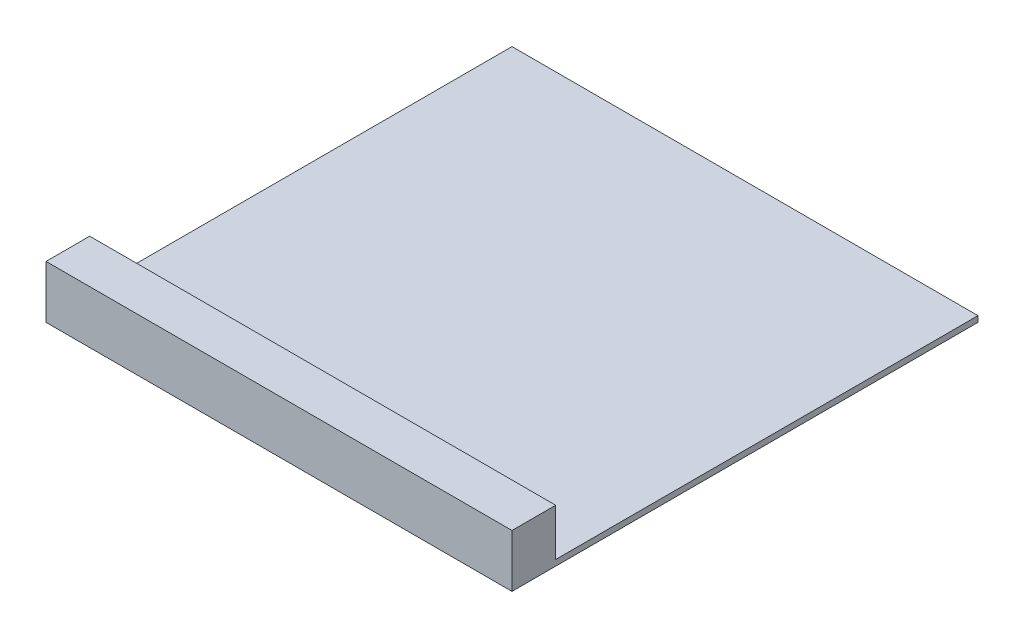
ISO-10303-21;
HEADER;
FILE_DESCRIPTION(('STEP AP214'),'2;1');
FILE_NAME('part.step','',(''),(''),'','','');
FILE_SCHEMA(('AUTOMOTIVE_DESIGN { 1 0 10303 214 1 1 1 1 }'));
ENDSEC;
DATA;
#1=APPLICATION_CONTEXT('core data for automotive mechanical design processes');
#2=APPLICATION_PROTOCOL_DEFINITION('international standard','automotive_design',2000,#1);
#3=PRODUCT_CONTEXT('',#1,'mechanical');
#4=PRODUCT('Part','Part','',(#3));
#5=PRODUCT_RELATED_PRODUCT_CATEGORY('part','',(#4));
#6=PRODUCT_DEFINITION_FORMATION('','',#4);
#7=PRODUCT_DEFINITION_CONTEXT('part definition',#1,'design');
#8=PRODUCT_DEFINITION('design','',#6,#7);
#9=PRODUCT_DEFINITION_SHAPE('','',#8);
#10=(LENGTH_UNIT() NAMED_UNIT(*) SI_UNIT(.MILLI.,.METRE.));
#11=(NAMED_UNIT(*) PLANE_ANGLE_UNIT() SI_UNIT($,.RADIAN.));
#12=(NAMED_UNIT(*) SI_UNIT($,.STERADIAN.) SOLID_ANGLE_UNIT());
#13=UNCERTAINTY_MEASURE_WITH_UNIT(LENGTH_MEASURE(1.E-05),#10,'distance_accuracy_value','');
#14=(GEOMETRIC_REPRESENTATION_CONTEXT(3) GLOBAL_UNCERTAINTY_ASSIGNED_CONTEXT((#13)) GLOBAL_UNIT_ASSIGNED_CONTEXT((#10,
#11,#12)) REPRESENTATION_CONTEXT('',''));
#15=CARTESIAN_POINT('',(0.,0.,0.));
#16=DIRECTION('',(0.,0.,1.));
#17=DIRECTION('',(1.,0.,0.));
#18=AXIS2_PLACEMENT_3D('',#15,#16,#17);
#19=CARTESIAN_POINT('',(-64.,14.5,-64.));
#20=DIRECTION('',(1.,0.,0.));
#21=DIRECTION('',(0.,0.,-1.));
#22=AXIS2_PLACEMENT_3D('',#19,#20,#21);
#23=PLANE('',#22);
#24=DIRECTION('',(0.,1.,0.));
#25=VECTOR('',#24,1.);
#26=CARTESIAN_POINT('',(-64.,-172.742583053513,52.));
#27=LINE('',#26,#25);
#28=CARTESIAN_POINT('',(-64.,1.59999999999999,52.));
#29=VERTEX_POINT('',#28);
#30=CARTESIAN_POINT('',(-64.,14.5,52.));
#31=VERTEX_POINT('',#30);
#32=EDGE_CURVE('E66',#29,#31,#27,.T.);
#33=ORIENTED_EDGE('',*,*,#32,.F.);
#34=DIRECTION('',(0.,0.,1.));
#35=VECTOR('',#34,1.);
#36=CARTESIAN_POINT('',(-64.,1.59999999999999,-64.));
#37=LINE('',#36,#35);
#38=CARTESIAN_POINT('',(-64.,1.59999999999999,-64.));
#39=VERTEX_POINT('',#38);
#40=EDGE_CURVE('E102',#39,#29,#37,.T.);
#41=ORIENTED_EDGE('',*,*,#40,.F.);
#42=DIRECTION('',(0.,-1.,0.));
#43=VECTOR('',#42,1.);
#44=CARTESIAN_POINT('',(-64.,14.5,-64.));
#45=LINE('',#44,#43);
#46=CARTESIAN_POINT('',(-64.,0.,-64.));
#47=VERTEX_POINT('',#46);
#48=EDGE_CURVE('E95',#39,#47,#45,.T.);
#49=ORIENTED_EDGE('',*,*,#48,.T.);
#50=DIRECTION('',(0.,0.,1.));
#51=VECTOR('',#50,1.);
#52=CARTESIAN_POINT('',(-64.,0.,-64.));
#53=LINE('',#52,#51);
#54=CARTESIAN_POINT('',(-64.,0.,64.));
#55=VERTEX_POINT('',#54);
#56=EDGE_CURVE('E99',#47,#55,#53,.T.);
#57=ORIENTED_EDGE('',*,*,#56,.T.);
#58=DIRECTION('',(0.,-1.,0.));
#59=VECTOR('',#58,1.);
#60=CARTESIAN_POINT('',(-64.,14.5,64.));
#61=LINE('',#60,#59);
#62=CARTESIAN_POINT('',(-64.,14.5,64.));
#63=VERTEX_POINT('',#62);
#64=EDGE_CURVE('E12',#63,#55,#61,.T.);
#65=ORIENTED_EDGE('',*,*,#64,.F.);
#66=DIRECTION('',(0.,0.,1.));
#67=VECTOR('',#66,1.);
#68=CARTESIAN_POINT('',(-64.,14.5,-64.));
#69=LINE('',#68,#67);
#70=EDGE_CURVE('E117',#31,#63,#69,.T.);
#71=ORIENTED_EDGE('',*,*,#70,.F.);
#72=EDGE_LOOP('',(#33,#41,#49,#57,#65,#71));
#73=FACE_BOUND('',#72,.T.);
#74=ADVANCED_FACE('F51',(#73),#23,.F.);
#75=CARTESIAN_POINT('',(64.,14.5,64.));
#76=DIRECTION('',(0.,0.,-1.));
#77=DIRECTION('',(-1.,0.,0.));
#78=AXIS2_PLACEMENT_3D('',#75,#76,#77);
#79=PLANE('',#78);
#80=DIRECTION('',(1.,0.,0.));
#81=VECTOR('',#80,1.);
#82=CARTESIAN_POINT('',(64.,0.,64.));
#83=LINE('',#82,#81);
#84=CARTESIAN_POINT('',(64.,0.,64.));
#85=VERTEX_POINT('',#84);
#86=EDGE_CURVE('E121',#55,#85,#83,.T.);
#87=ORIENTED_EDGE('',*,*,#86,.T.);
#88=DIRECTION('',(0.,-1.,0.));
#89=VECTOR('',#88,1.);
#90=CARTESIAN_POINT('',(64.,14.5,64.));
#91=LINE('',#90,#89);
#92=CARTESIAN_POINT('',(64.,14.5,64.));
#93=VERTEX_POINT('',#92);
#94=EDGE_CURVE('E59',#93,#85,#91,.T.);
#95=ORIENTED_EDGE('',*,*,#94,.F.);
#96=DIRECTION('',(1.,0.,0.));
#97=VECTOR('',#96,1.);
#98=CARTESIAN_POINT('',(64.,14.5,64.));
#99=LINE('',#98,#97);
#100=EDGE_CURVE('E75',#63,#93,#99,.T.);
#101=ORIENTED_EDGE('',*,*,#100,.F.);
#102=ORIENTED_EDGE('',*,*,#64,.T.);
#103=EDGE_LOOP('',(#87,#95,#101,#102));
#104=FACE_BOUND('',#103,.T.);
#105=ADVANCED_FACE('F145',(#104),#79,.F.);
#106=CARTESIAN_POINT('',(64.,14.5,-64.));
#107=DIRECTION('',(-1.,0.,0.));
#108=DIRECTION('',(0.,0.,1.));
#109=AXIS2_PLACEMENT_3D('',#106,#107,#108);
#110=PLANE('',#109);
#111=DIRECTION('',(0.,-1.,0.));
#112=VECTOR('',#111,1.);
#113=CARTESIAN_POINT('',(64.,14.5,-64.));
#114=LINE('',#113,#112);
#115=CARTESIAN_POINT('',(64.,1.59999999999999,-64.));
#116=VERTEX_POINT('',#115);
#117=CARTESIAN_POINT('',(64.,0.,-64.));
#118=VERTEX_POINT('',#117);
#119=EDGE_CURVE('E106',#116,#118,#114,.T.);
#120=ORIENTED_EDGE('',*,*,#119,.F.);
#121=DIRECTION('',(0.,0.,-1.));
#122=VECTOR('',#121,1.);
#123=CARTESIAN_POINT('',(64.,1.59999999999999,-64.));
#124=LINE('',#123,#122);
#125=CARTESIAN_POINT('',(64.,1.59999999999999,52.));
#126=VERTEX_POINT('',#125);
#127=EDGE_CURVE('E156',#126,#116,#124,.T.);
#128=ORIENTED_EDGE('',*,*,#127,.F.);
#129=DIRECTION('',(0.,1.,0.));
#130=VECTOR('',#129,1.);
#131=CARTESIAN_POINT('',(64.,-172.742583053513,52.));
#132=LINE('',#131,#130);
#133=CARTESIAN_POINT('',(64.,14.5,52.));
#134=VERTEX_POINT('',#133);
#135=EDGE_CURVE('E153',#126,#134,#132,.T.);
#136=ORIENTED_EDGE('',*,*,#135,.T.);
#137=DIRECTION('',(0.,0.,-1.));
#138=VECTOR('',#137,1.);
#139=CARTESIAN_POINT('',(64.,14.5,-64.));
#140=LINE('',#139,#138);
#141=EDGE_CURVE('E107',#93,#134,#140,.T.);
#142=ORIENTED_EDGE('',*,*,#141,.F.);
#143=ORIENTED_EDGE('',*,*,#94,.T.);
#144=DIRECTION('',(0.,0.,-1.));
#145=VECTOR('',#144,1.);
#146=CARTESIAN_POINT('',(64.,0.,-64.));
#147=LINE('',#146,#145);
#148=EDGE_CURVE('E118',#85,#118,#147,.T.);
#149=ORIENTED_EDGE('',*,*,#148,.T.);
#150=EDGE_LOOP('',(#120,#128,#136,#142,#143,#149));
#151=FACE_BOUND('',#150,.T.);
#152=ADVANCED_FACE('F142',(#151),#110,.F.);
#153=CARTESIAN_POINT('',(64.,14.5,-64.));
#154=DIRECTION('',(0.,0.,1.));
#155=DIRECTION('',(1.,0.,0.));
#156=AXIS2_PLACEMENT_3D('',#153,#154,#155);
#157=PLANE('',#156);
#158=ORIENTED_EDGE('',*,*,#48,.F.);
#159=DIRECTION('',(-1.,0.,0.));
#160=VECTOR('',#159,1.);
#161=CARTESIAN_POINT('',(-64.,1.59999999999999,-64.));
#162=LINE('',#161,#160);
#163=EDGE_CURVE('E161',#116,#39,#162,.T.);
#164=ORIENTED_EDGE('',*,*,#163,.F.);
#165=ORIENTED_EDGE('',*,*,#119,.T.);
#166=DIRECTION('',(-1.,0.,0.));
#167=VECTOR('',#166,1.);
#168=CARTESIAN_POINT('',(64.,0.,-64.));
#169=LINE('',#168,#167);
#170=EDGE_CURVE('E110',#118,#47,#169,.T.);
#171=ORIENTED_EDGE('',*,*,#170,.T.);
#172=EDGE_LOOP('',(#158,#164,#165,#171));
#173=FACE_BOUND('',#172,.T.);
#174=ADVANCED_FACE('F111',(#173),#157,.F.);
#175=CARTESIAN_POINT('',(0.,14.5,0.));
#176=DIRECTION('',(0.,-1.,0.));
#177=DIRECTION('',(0.,0.,-1.));
#178=AXIS2_PLACEMENT_3D('',#175,#176,#177);
#179=PLANE('',#178);
#180=ORIENTED_EDGE('',*,*,#141,.T.);
#181=DIRECTION('',(1.,0.,0.));
#182=VECTOR('',#181,1.);
#183=CARTESIAN_POINT('',(-64.,14.5,52.));
#184=LINE('',#183,#182);
#185=EDGE_CURVE('E168',#31,#134,#184,.T.);
#186=ORIENTED_EDGE('',*,*,#185,.F.);
#187=ORIENTED_EDGE('',*,*,#70,.T.);
#188=ORIENTED_EDGE('',*,*,#100,.T.);
#189=EDGE_LOOP('',(#180,#186,#187,#188));
#190=FACE_BOUND('',#189,.T.);
#191=ADVANCED_FACE('F176',(#190),#179,.F.);
#192=CARTESIAN_POINT('',(0.,0.,0.));
#193=DIRECTION('',(0.,-1.,0.));
#194=DIRECTION('',(0.,0.,-1.));
#195=AXIS2_PLACEMENT_3D('',#192,#193,#194);
#196=PLANE('',#195);
#197=ORIENTED_EDGE('',*,*,#56,.F.);
#198=ORIENTED_EDGE('',*,*,#170,.F.);
#199=ORIENTED_EDGE('',*,*,#148,.F.);
#200=ORIENTED_EDGE('',*,*,#86,.F.);
#201=EDGE_LOOP('',(#197,#198,#199,#200));
#202=FACE_BOUND('',#201,.T.);
#203=ADVANCED_FACE('F120',(#202),#196,.T.);
#204=CARTESIAN_POINT('',(0.,1.6,0.));
#205=DIRECTION('',(0.,-1.,0.));
#206=DIRECTION('',(0.,0.,-1.));
#207=AXIS2_PLACEMENT_3D('',#204,#205,#206);
#208=PLANE('',#207);
#209=ORIENTED_EDGE('',*,*,#40,.T.);
#210=DIRECTION('',(1.,0.,0.));
#211=VECTOR('',#210,1.);
#212=CARTESIAN_POINT('',(-64.,1.59999999999999,52.));
#213=LINE('',#212,#211);
#214=EDGE_CURVE('E157',#29,#126,#213,.T.);
#215=ORIENTED_EDGE('',*,*,#214,.T.);
#216=ORIENTED_EDGE('',*,*,#127,.T.);
#217=ORIENTED_EDGE('',*,*,#163,.T.);
#218=EDGE_LOOP('',(#209,#215,#216,#217));
#219=FACE_BOUND('',#218,.T.);
#220=ADVANCED_FACE('F197',(#219),#208,.F.);
#221=CARTESIAN_POINT('',(-64.,-172.742583053513,52.));
#222=DIRECTION('',(0.,0.,1.));
#223=DIRECTION('',(1.,0.,0.));
#224=AXIS2_PLACEMENT_3D('',#221,#222,#223);
#225=PLANE('',#224);
#226=ORIENTED_EDGE('',*,*,#32,.T.);
#227=ORIENTED_EDGE('',*,*,#185,.T.);
#228=ORIENTED_EDGE('',*,*,#135,.F.);
#229=ORIENTED_EDGE('',*,*,#214,.F.);
#230=EDGE_LOOP('',(#226,#227,#228,#229));
#231=FACE_BOUND('',#230,.T.);
#232=ADVANCED_FACE('F172',(#231),#225,.F.);
#233=CLOSED_SHELL('',(#74,#105,#152,#174,#191,#203,#220,#232));
#234=MANIFOLD_SOLID_BREP('B2',#233);
#235=ADVANCED_BREP_SHAPE_REPRESENTATION('',(#18,#234),#14);
#236=SHAPE_DEFINITION_REPRESENTATION(#9,#235);
ENDSEC;
END-ISO-10303-21;
